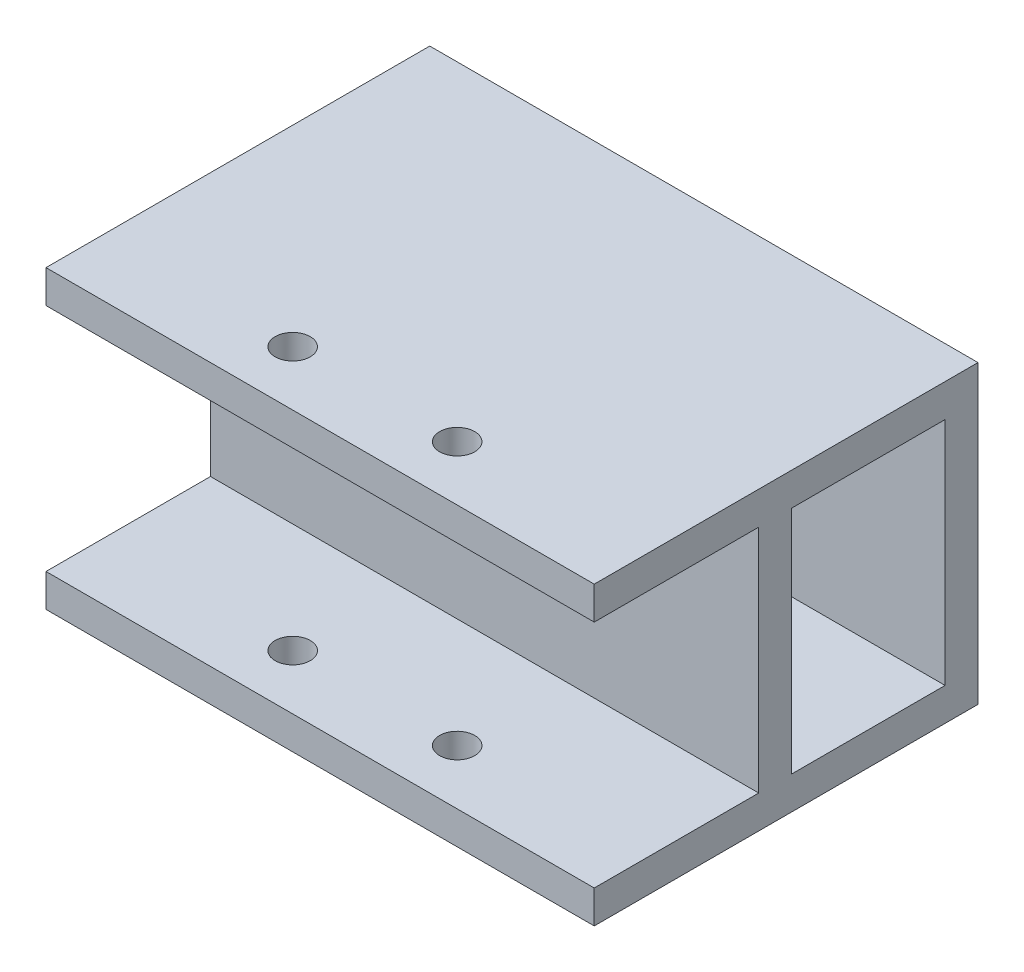
ISO-10303-21;
HEADER;
FILE_DESCRIPTION(('STEP AP214'),'2;1');
FILE_NAME('part.step','',(''),(''),'','','');
FILE_SCHEMA(('AUTOMOTIVE_DESIGN { 1 0 10303 214 1 1 1 1 }'));
ENDSEC;
DATA;
#1=APPLICATION_CONTEXT('core data for automotive mechanical design processes');
#2=APPLICATION_PROTOCOL_DEFINITION('international standard','automotive_design',2000,#1);
#3=PRODUCT_CONTEXT('',#1,'mechanical');
#4=PRODUCT('Part','Part','',(#3));
#5=PRODUCT_RELATED_PRODUCT_CATEGORY('part','',(#4));
#6=PRODUCT_DEFINITION_FORMATION('','',#4);
#7=PRODUCT_DEFINITION_CONTEXT('part definition',#1,'design');
#8=PRODUCT_DEFINITION('design','',#6,#7);
#9=PRODUCT_DEFINITION_SHAPE('','',#8);
#10=(LENGTH_UNIT() NAMED_UNIT(*) SI_UNIT(.MILLI.,.METRE.));
#11=(NAMED_UNIT(*) PLANE_ANGLE_UNIT() SI_UNIT($,.RADIAN.));
#12=(NAMED_UNIT(*) SI_UNIT($,.STERADIAN.) SOLID_ANGLE_UNIT());
#13=UNCERTAINTY_MEASURE_WITH_UNIT(LENGTH_MEASURE(1.E-05),#10,'distance_accuracy_value','');
#14=(GEOMETRIC_REPRESENTATION_CONTEXT(3) GLOBAL_UNCERTAINTY_ASSIGNED_CONTEXT((#13)) GLOBAL_UNIT_ASSIGNED_CONTEXT((#10,
#11,#12)) REPRESENTATION_CONTEXT('',''));
#15=CARTESIAN_POINT('',(0.,0.,0.));
#16=DIRECTION('',(0.,0.,1.));
#17=DIRECTION('',(1.,0.,0.));
#18=AXIS2_PLACEMENT_3D('',#15,#16,#17);
#19=CARTESIAN_POINT('',(0.,0.,35.));
#20=DIRECTION('',(0.,0.,1.));
#21=DIRECTION('',(1.,0.,0.));
#22=AXIS2_PLACEMENT_3D('',#19,#20,#21);
#23=PLANE('',#22);
#24=DIRECTION('',(-1.,0.,0.));
#25=VECTOR('',#24,1.);
#26=CARTESIAN_POINT('',(-21.1991434689508,10.3297644539615,35.));
#27=LINE('',#26,#25);
#28=CARTESIAN_POINT('',(28.8008565310493,10.3297644539615,35.));
#29=VERTEX_POINT('',#28);
#30=CARTESIAN_POINT('',(-21.1991434689508,10.3297644539615,35.));
#31=VERTEX_POINT('',#30);
#32=EDGE_CURVE('E216',#29,#31,#27,.T.);
#33=ORIENTED_EDGE('',*,*,#32,.F.);
#34=DIRECTION('',(0.,1.,0.));
#35=VECTOR('',#34,1.);
#36=CARTESIAN_POINT('',(28.8008565310493,13.3297644539615,35.));
#37=LINE('',#36,#35);
#38=CARTESIAN_POINT('',(28.8008565310493,13.3297644539615,35.));
#39=VERTEX_POINT('',#38);
#40=EDGE_CURVE('E254',#29,#39,#37,.T.);
#41=ORIENTED_EDGE('',*,*,#40,.T.);
#42=DIRECTION('',(-1.,0.,0.));
#43=VECTOR('',#42,1.);
#44=CARTESIAN_POINT('',(-21.1991434689508,13.3297644539615,35.));
#45=LINE('',#44,#43);
#46=CARTESIAN_POINT('',(-21.1991434689508,13.3297644539615,35.));
#47=VERTEX_POINT('',#46);
#48=EDGE_CURVE('E259',#39,#47,#45,.T.);
#49=ORIENTED_EDGE('',*,*,#48,.T.);
#50=DIRECTION('',(0.,-1.,0.));
#51=VECTOR('',#50,1.);
#52=CARTESIAN_POINT('',(-21.1991434689508,13.3297644539615,35.));
#53=LINE('',#52,#51);
#54=EDGE_CURVE('E246',#47,#31,#53,.T.);
#55=ORIENTED_EDGE('',*,*,#54,.T.);
#56=EDGE_LOOP('',(#33,#41,#49,#55));
#57=FACE_BOUND('',#56,.T.);
#58=ADVANCED_FACE('F45',(#57),#23,.T.);
#59=CARTESIAN_POINT('',(-21.1991434689508,13.3297644539615,35.));
#60=DIRECTION('',(1.,0.,0.));
#61=DIRECTION('',(0.,1.,0.));
#62=AXIS2_PLACEMENT_3D('',#59,#60,#61);
#63=PLANE('',#62);
#64=DIRECTION('',(0.,0.,1.));
#65=VECTOR('',#64,1.);
#66=CARTESIAN_POINT('',(-21.1991434689507,-10.6702355460385,3.));
#67=LINE('',#66,#65);
#68=CARTESIAN_POINT('',(-21.1991434689507,-10.6702355460385,3.));
#69=VERTEX_POINT('',#68);
#70=CARTESIAN_POINT('',(-21.1991434689507,-10.6702355460385,17.));
#71=VERTEX_POINT('',#70);
#72=EDGE_CURVE('E171',#69,#71,#67,.T.);
#73=ORIENTED_EDGE('',*,*,#72,.F.);
#74=DIRECTION('',(0.,-1.,0.));
#75=VECTOR('',#74,1.);
#76=CARTESIAN_POINT('',(-21.1991434689508,10.3297644539615,3.));
#77=LINE('',#76,#75);
#78=CARTESIAN_POINT('',(-21.1991434689508,10.3297644539615,3.));
#79=VERTEX_POINT('',#78);
#80=EDGE_CURVE('E63',#79,#69,#77,.T.);
#81=ORIENTED_EDGE('',*,*,#80,.F.);
#82=DIRECTION('',(0.,0.,-1.));
#83=VECTOR('',#82,1.);
#84=CARTESIAN_POINT('',(-21.1991434689508,10.3297644539615,3.));
#85=LINE('',#84,#83);
#86=CARTESIAN_POINT('',(-21.1991434689508,10.3297644539615,17.));
#87=VERTEX_POINT('',#86);
#88=EDGE_CURVE('E158',#87,#79,#85,.T.);
#89=ORIENTED_EDGE('',*,*,#88,.F.);
#90=DIRECTION('',(0.,1.,0.));
#91=VECTOR('',#90,1.);
#92=CARTESIAN_POINT('',(-21.1991434689508,10.3297644539615,17.));
#93=LINE('',#92,#91);
#94=EDGE_CURVE('E162',#71,#87,#93,.T.);
#95=ORIENTED_EDGE('',*,*,#94,.F.);
#96=EDGE_LOOP('',(#73,#81,#89,#95));
#97=FACE_BOUND('',#96,.T.);
#98=DIRECTION('',(0.,-1.,0.));
#99=VECTOR('',#98,1.);
#100=CARTESIAN_POINT('',(-21.1991434689508,10.3297644539615,20.));
#101=LINE('',#100,#99);
#102=CARTESIAN_POINT('',(-21.1991434689508,10.3297644539615,20.));
#103=VERTEX_POINT('',#102);
#104=CARTESIAN_POINT('',(-21.1991434689508,-10.6702355460385,20.));
#105=VERTEX_POINT('',#104);
#106=EDGE_CURVE('E211',#103,#105,#101,.T.);
#107=ORIENTED_EDGE('',*,*,#106,.F.);
#108=DIRECTION('',(0.,0.,1.));
#109=VECTOR('',#108,1.);
#110=CARTESIAN_POINT('',(-21.1991434689508,10.3297644539615,20.));
#111=LINE('',#110,#109);
#112=EDGE_CURVE('E232',#103,#31,#111,.T.);
#113=ORIENTED_EDGE('',*,*,#112,.T.);
#114=ORIENTED_EDGE('',*,*,#54,.F.);
#115=DIRECTION('',(0.,0.,-1.));
#116=VECTOR('',#115,1.);
#117=CARTESIAN_POINT('',(-21.1991434689508,13.3297644539615,35.));
#118=LINE('',#117,#116);
#119=CARTESIAN_POINT('',(-21.1991434689508,13.3297644539615,0.));
#120=VERTEX_POINT('',#119);
#121=EDGE_CURVE('E262',#47,#120,#118,.T.);
#122=ORIENTED_EDGE('',*,*,#121,.T.);
#123=DIRECTION('',(0.,-1.,0.));
#124=VECTOR('',#123,1.);
#125=CARTESIAN_POINT('',(-21.1991434689508,13.3297644539615,0.));
#126=LINE('',#125,#124);
#127=CARTESIAN_POINT('',(-21.1991434689507,-13.6702355460385,0.));
#128=VERTEX_POINT('',#127);
#129=EDGE_CURVE('E236',#120,#128,#126,.T.);
#130=ORIENTED_EDGE('',*,*,#129,.T.);
#131=DIRECTION('',(0.,0.,-1.));
#132=VECTOR('',#131,1.);
#133=CARTESIAN_POINT('',(-21.1991434689507,-13.6702355460385,35.));
#134=LINE('',#133,#132);
#135=CARTESIAN_POINT('',(-21.1991434689507,-13.6702355460385,35.));
#136=VERTEX_POINT('',#135);
#137=EDGE_CURVE('E11',#136,#128,#134,.T.);
#138=ORIENTED_EDGE('',*,*,#137,.F.);
#139=CARTESIAN_POINT('',(-21.1991434689507,-10.6702355460385,35.));
#140=VERTEX_POINT('',#139);
#141=EDGE_CURVE('E251',#140,#136,#53,.T.);
#142=ORIENTED_EDGE('',*,*,#141,.F.);
#143=DIRECTION('',(0.,0.,1.));
#144=VECTOR('',#143,1.);
#145=CARTESIAN_POINT('',(-21.1991434689508,-10.6702355460385,20.));
#146=LINE('',#145,#144);
#147=EDGE_CURVE('E227',#105,#140,#146,.T.);
#148=ORIENTED_EDGE('',*,*,#147,.F.);
#149=EDGE_LOOP('',(#107,#113,#114,#122,#130,#138,#142,#148));
#150=FACE_BOUND('',#149,.T.);
#151=ADVANCED_FACE('F47',(#97,#150),#63,.F.);
#152=CARTESIAN_POINT('',(-21.1991434689507,-13.6702355460385,35.));
#153=DIRECTION('',(0.,1.,0.));
#154=DIRECTION('',(0.,0.,1.));
#155=AXIS2_PLACEMENT_3D('',#152,#153,#154);
#156=PLANE('',#155);
#157=CARTESIAN_POINT('',(11.3008565310493,-13.6702355460385,30.));
#158=DIRECTION('',(0.,-1.,0.));
#159=DIRECTION('',(0.,0.,-1.));
#160=AXIS2_PLACEMENT_3D('',#157,#158,#159);
#161=CIRCLE('',#160,1.6);
#162=CARTESIAN_POINT('',(11.3008565310493,-13.6702355460385,28.4));
#163=VERTEX_POINT('',#162);
#164=EDGE_CURVE('E191',#163,#163,#161,.T.);
#165=ORIENTED_EDGE('',*,*,#164,.F.);
#166=EDGE_LOOP('',(#165));
#167=FACE_BOUND('',#166,.T.);
#168=CARTESIAN_POINT('',(-3.69914346895074,-13.6702355460385,30.));
#169=DIRECTION('',(0.,-1.,0.));
#170=DIRECTION('',(0.,0.,-1.));
#171=AXIS2_PLACEMENT_3D('',#168,#169,#170);
#172=CIRCLE('',#171,1.6);
#173=CARTESIAN_POINT('',(-3.69914346895074,-13.6702355460385,28.4));
#174=VERTEX_POINT('',#173);
#175=EDGE_CURVE('E195',#174,#174,#172,.T.);
#176=ORIENTED_EDGE('',*,*,#175,.F.);
#177=EDGE_LOOP('',(#176));
#178=FACE_BOUND('',#177,.T.);
#179=DIRECTION('',(1.,0.,0.));
#180=VECTOR('',#179,1.);
#181=CARTESIAN_POINT('',(-21.1991434689507,-13.6702355460385,0.));
#182=LINE('',#181,#180);
#183=CARTESIAN_POINT('',(28.8008565310493,-13.6702355460385,0.));
#184=VERTEX_POINT('',#183);
#185=EDGE_CURVE('E266',#128,#184,#182,.T.);
#186=ORIENTED_EDGE('',*,*,#185,.T.);
#187=DIRECTION('',(0.,0.,-1.));
#188=VECTOR('',#187,1.);
#189=CARTESIAN_POINT('',(28.8008565310493,-13.6702355460385,35.));
#190=LINE('',#189,#188);
#191=CARTESIAN_POINT('',(28.8008565310493,-13.6702355460385,35.));
#192=VERTEX_POINT('',#191);
#193=EDGE_CURVE('E55',#192,#184,#190,.T.);
#194=ORIENTED_EDGE('',*,*,#193,.F.);
#195=DIRECTION('',(1.,0.,0.));
#196=VECTOR('',#195,1.);
#197=CARTESIAN_POINT('',(-21.1991434689507,-13.6702355460385,35.));
#198=LINE('',#197,#196);
#199=EDGE_CURVE('E250',#136,#192,#198,.T.);
#200=ORIENTED_EDGE('',*,*,#199,.F.);
#201=ORIENTED_EDGE('',*,*,#137,.T.);
#202=EDGE_LOOP('',(#186,#194,#200,#201));
#203=FACE_BOUND('',#202,.T.);
#204=ADVANCED_FACE('F319',(#167,#178,#203),#156,.F.);
#205=CARTESIAN_POINT('',(28.8008565310493,13.3297644539615,35.));
#206=DIRECTION('',(-1.,0.,0.));
#207=DIRECTION('',(0.,-1.,0.));
#208=AXIS2_PLACEMENT_3D('',#205,#206,#207);
#209=PLANE('',#208);
#210=DIRECTION('',(0.,0.,-1.));
#211=VECTOR('',#210,1.);
#212=CARTESIAN_POINT('',(28.8008565310493,10.3297644539615,3.));
#213=LINE('',#212,#211);
#214=CARTESIAN_POINT('',(28.8008565310493,10.3297644539615,17.));
#215=VERTEX_POINT('',#214);
#216=CARTESIAN_POINT('',(28.8008565310493,10.3297644539615,3.));
#217=VERTEX_POINT('',#216);
#218=EDGE_CURVE('E146',#215,#217,#213,.T.);
#219=ORIENTED_EDGE('',*,*,#218,.T.);
#220=DIRECTION('',(0.,-1.,0.));
#221=VECTOR('',#220,1.);
#222=CARTESIAN_POINT('',(28.8008565310493,10.3297644539615,3.));
#223=LINE('',#222,#221);
#224=CARTESIAN_POINT('',(28.8008565310493,-10.6702355460385,3.));
#225=VERTEX_POINT('',#224);
#226=EDGE_CURVE('E139',#217,#225,#223,.T.);
#227=ORIENTED_EDGE('',*,*,#226,.T.);
#228=DIRECTION('',(0.,0.,1.));
#229=VECTOR('',#228,1.);
#230=CARTESIAN_POINT('',(28.8008565310493,-10.6702355460385,3.));
#231=LINE('',#230,#229);
#232=CARTESIAN_POINT('',(28.8008565310493,-10.6702355460385,17.));
#233=VERTEX_POINT('',#232);
#234=EDGE_CURVE('E149',#225,#233,#231,.T.);
#235=ORIENTED_EDGE('',*,*,#234,.T.);
#236=DIRECTION('',(0.,1.,0.));
#237=VECTOR('',#236,1.);
#238=CARTESIAN_POINT('',(28.8008565310493,10.3297644539615,17.));
#239=LINE('',#238,#237);
#240=EDGE_CURVE('E71',#233,#215,#239,.T.);
#241=ORIENTED_EDGE('',*,*,#240,.T.);
#242=EDGE_LOOP('',(#219,#227,#235,#241));
#243=FACE_BOUND('',#242,.T.);
#244=ORIENTED_EDGE('',*,*,#40,.F.);
#245=DIRECTION('',(0.,0.,1.));
#246=VECTOR('',#245,1.);
#247=CARTESIAN_POINT('',(28.8008565310493,10.3297644539615,20.));
#248=LINE('',#247,#246);
#249=CARTESIAN_POINT('',(28.8008565310493,10.3297644539615,20.));
#250=VERTEX_POINT('',#249);
#251=EDGE_CURVE('E237',#250,#29,#248,.T.);
#252=ORIENTED_EDGE('',*,*,#251,.F.);
#253=DIRECTION('',(0.,1.,0.));
#254=VECTOR('',#253,1.);
#255=CARTESIAN_POINT('',(28.8008565310493,10.3297644539615,20.));
#256=LINE('',#255,#254);
#257=CARTESIAN_POINT('',(28.8008565310493,-10.6702355460385,20.));
#258=VERTEX_POINT('',#257);
#259=EDGE_CURVE('E220',#258,#250,#256,.T.);
#260=ORIENTED_EDGE('',*,*,#259,.F.);
#261=DIRECTION('',(0.,0.,1.));
#262=VECTOR('',#261,1.);
#263=CARTESIAN_POINT('',(28.8008565310493,-10.6702355460385,20.));
#264=LINE('',#263,#262);
#265=CARTESIAN_POINT('',(28.8008565310493,-10.6702355460385,35.));
#266=VERTEX_POINT('',#265);
#267=EDGE_CURVE('E240',#258,#266,#264,.T.);
#268=ORIENTED_EDGE('',*,*,#267,.T.);
#269=EDGE_CURVE('E255',#192,#266,#37,.T.);
#270=ORIENTED_EDGE('',*,*,#269,.F.);
#271=ORIENTED_EDGE('',*,*,#193,.T.);
#272=DIRECTION('',(0.,1.,0.));
#273=VECTOR('',#272,1.);
#274=CARTESIAN_POINT('',(28.8008565310493,13.3297644539615,0.));
#275=LINE('',#274,#273);
#276=CARTESIAN_POINT('',(28.8008565310493,13.3297644539615,0.));
#277=VERTEX_POINT('',#276);
#278=EDGE_CURVE('E269',#184,#277,#275,.T.);
#279=ORIENTED_EDGE('',*,*,#278,.T.);
#280=DIRECTION('',(0.,0.,-1.));
#281=VECTOR('',#280,1.);
#282=CARTESIAN_POINT('',(28.8008565310493,13.3297644539615,35.));
#283=LINE('',#282,#281);
#284=EDGE_CURVE('E278',#39,#277,#283,.T.);
#285=ORIENTED_EDGE('',*,*,#284,.F.);
#286=EDGE_LOOP('',(#244,#252,#260,#268,#270,#271,#279,#285));
#287=FACE_BOUND('',#286,.T.);
#288=ADVANCED_FACE('F154',(#243,#287),#209,.F.);
#289=CARTESIAN_POINT('',(-21.1991434689508,13.3297644539615,35.));
#290=DIRECTION('',(0.,-1.,0.));
#291=DIRECTION('',(0.,0.,-1.));
#292=AXIS2_PLACEMENT_3D('',#289,#290,#291);
#293=PLANE('',#292);
#294=CARTESIAN_POINT('',(11.3008565310493,13.3297644539615,30.));
#295=DIRECTION('',(0.,-1.,0.));
#296=DIRECTION('',(0.,0.,-1.));
#297=AXIS2_PLACEMENT_3D('',#294,#295,#296);
#298=CIRCLE('',#297,1.6);
#299=CARTESIAN_POINT('',(11.3008565310493,13.3297644539615,28.4));
#300=VERTEX_POINT('',#299);
#301=EDGE_CURVE('E186',#300,#300,#298,.T.);
#302=ORIENTED_EDGE('',*,*,#301,.T.);
#303=EDGE_LOOP('',(#302));
#304=FACE_BOUND('',#303,.T.);
#305=CARTESIAN_POINT('',(-3.69914346895074,13.3297644539615,30.));
#306=DIRECTION('',(0.,-1.,0.));
#307=DIRECTION('',(0.,0.,-1.));
#308=AXIS2_PLACEMENT_3D('',#305,#306,#307);
#309=CIRCLE('',#308,1.6);
#310=CARTESIAN_POINT('',(-3.69914346895074,13.3297644539615,28.4));
#311=VERTEX_POINT('',#310);
#312=EDGE_CURVE('E180',#311,#311,#309,.T.);
#313=ORIENTED_EDGE('',*,*,#312,.T.);
#314=EDGE_LOOP('',(#313));
#315=FACE_BOUND('',#314,.T.);
#316=DIRECTION('',(-1.,0.,0.));
#317=VECTOR('',#316,1.);
#318=CARTESIAN_POINT('',(-21.1991434689508,13.3297644539615,0.));
#319=LINE('',#318,#317);
#320=EDGE_CURVE('E272',#277,#120,#319,.T.);
#321=ORIENTED_EDGE('',*,*,#320,.T.);
#322=ORIENTED_EDGE('',*,*,#121,.F.);
#323=ORIENTED_EDGE('',*,*,#48,.F.);
#324=ORIENTED_EDGE('',*,*,#284,.T.);
#325=EDGE_LOOP('',(#321,#322,#323,#324));
#326=FACE_BOUND('',#325,.T.);
#327=ADVANCED_FACE('F325',(#304,#315,#326),#293,.F.);
#328=DIRECTION('',(1.,0.,0.));
#329=VECTOR('',#328,1.);
#330=CARTESIAN_POINT('',(-21.1991434689508,-10.6702355460385,35.));
#331=LINE('',#330,#329);
#332=EDGE_CURVE('E210',#140,#266,#331,.T.);
#333=ORIENTED_EDGE('',*,*,#332,.F.);
#334=ORIENTED_EDGE('',*,*,#141,.T.);
#335=ORIENTED_EDGE('',*,*,#199,.T.);
#336=ORIENTED_EDGE('',*,*,#269,.T.);
#337=EDGE_LOOP('',(#333,#334,#335,#336));
#338=FACE_BOUND('',#337,.T.);
#339=ADVANCED_FACE('F313',(#338),#23,.T.);
#340=CARTESIAN_POINT('',(0.,0.,0.));
#341=DIRECTION('',(0.,0.,1.));
#342=DIRECTION('',(1.,0.,0.));
#343=AXIS2_PLACEMENT_3D('',#340,#341,#342);
#344=PLANE('',#343);
#345=ORIENTED_EDGE('',*,*,#129,.F.);
#346=ORIENTED_EDGE('',*,*,#320,.F.);
#347=ORIENTED_EDGE('',*,*,#278,.F.);
#348=ORIENTED_EDGE('',*,*,#185,.F.);
#349=EDGE_LOOP('',(#345,#346,#347,#348));
#350=FACE_BOUND('',#349,.T.);
#351=ADVANCED_FACE('F324',(#350),#344,.F.);
#352=CARTESIAN_POINT('',(-21.1991434689508,10.3297644539615,20.));
#353=DIRECTION('',(0.,1.,0.));
#354=DIRECTION('',(0.,0.,1.));
#355=AXIS2_PLACEMENT_3D('',#352,#353,#354);
#356=PLANE('',#355);
#357=CARTESIAN_POINT('',(11.3008565310493,10.3297644539615,30.));
#358=DIRECTION('',(0.,1.,0.));
#359=DIRECTION('',(0.,0.,1.));
#360=AXIS2_PLACEMENT_3D('',#357,#358,#359);
#361=CIRCLE('',#360,1.6);
#362=CARTESIAN_POINT('',(11.3008565310493,10.3297644539615,31.6));
#363=VERTEX_POINT('',#362);
#364=EDGE_CURVE('E206',#363,#363,#361,.T.);
#365=ORIENTED_EDGE('',*,*,#364,.T.);
#366=EDGE_LOOP('',(#365));
#367=FACE_BOUND('',#366,.T.);
#368=CARTESIAN_POINT('',(-3.69914346895074,10.3297644539615,30.));
#369=DIRECTION('',(0.,1.,0.));
#370=DIRECTION('',(0.,0.,1.));
#371=AXIS2_PLACEMENT_3D('',#368,#369,#370);
#372=CIRCLE('',#371,1.6);
#373=CARTESIAN_POINT('',(-3.69914346895074,10.3297644539615,31.6));
#374=VERTEX_POINT('',#373);
#375=EDGE_CURVE('E202',#374,#374,#372,.T.);
#376=ORIENTED_EDGE('',*,*,#375,.T.);
#377=EDGE_LOOP('',(#376));
#378=FACE_BOUND('',#377,.T.);
#379=ORIENTED_EDGE('',*,*,#32,.T.);
#380=ORIENTED_EDGE('',*,*,#112,.F.);
#381=DIRECTION('',(-1.,0.,0.));
#382=VECTOR('',#381,1.);
#383=CARTESIAN_POINT('',(-21.1991434689508,10.3297644539615,20.));
#384=LINE('',#383,#382);
#385=EDGE_CURVE('E223',#250,#103,#384,.T.);
#386=ORIENTED_EDGE('',*,*,#385,.F.);
#387=ORIENTED_EDGE('',*,*,#251,.T.);
#388=EDGE_LOOP('',(#379,#380,#386,#387));
#389=FACE_BOUND('',#388,.T.);
#390=ADVANCED_FACE('F329',(#367,#378,#389),#356,.F.);
#391=CARTESIAN_POINT('',(-21.1991434689508,-10.6702355460385,20.));
#392=DIRECTION('',(0.,-1.,0.));
#393=DIRECTION('',(0.,0.,-1.));
#394=AXIS2_PLACEMENT_3D('',#391,#392,#393);
#395=PLANE('',#394);
#396=CARTESIAN_POINT('',(11.3008565310493,-10.6702355460385,30.));
#397=DIRECTION('',(0.,-1.,0.));
#398=DIRECTION('',(0.,0.,-1.));
#399=AXIS2_PLACEMENT_3D('',#396,#397,#398);
#400=CIRCLE('',#399,1.6);
#401=CARTESIAN_POINT('',(11.3008565310493,-10.6702355460385,28.4));
#402=VERTEX_POINT('',#401);
#403=EDGE_CURVE('E49',#402,#402,#400,.T.);
#404=ORIENTED_EDGE('',*,*,#403,.T.);
#405=EDGE_LOOP('',(#404));
#406=FACE_BOUND('',#405,.T.);
#407=CARTESIAN_POINT('',(-3.69914346895074,-10.6702355460385,30.));
#408=DIRECTION('',(0.,-1.,0.));
#409=DIRECTION('',(0.,0.,-1.));
#410=AXIS2_PLACEMENT_3D('',#407,#408,#409);
#411=CIRCLE('',#410,1.6);
#412=CARTESIAN_POINT('',(-3.69914346895074,-10.6702355460385,28.4));
#413=VERTEX_POINT('',#412);
#414=EDGE_CURVE('E190',#413,#413,#411,.T.);
#415=ORIENTED_EDGE('',*,*,#414,.T.);
#416=EDGE_LOOP('',(#415));
#417=FACE_BOUND('',#416,.T.);
#418=ORIENTED_EDGE('',*,*,#332,.T.);
#419=ORIENTED_EDGE('',*,*,#267,.F.);
#420=DIRECTION('',(1.,0.,0.));
#421=VECTOR('',#420,1.);
#422=CARTESIAN_POINT('',(-21.1991434689508,-10.6702355460385,20.));
#423=LINE('',#422,#421);
#424=EDGE_CURVE('E215',#105,#258,#423,.T.);
#425=ORIENTED_EDGE('',*,*,#424,.F.);
#426=ORIENTED_EDGE('',*,*,#147,.T.);
#427=EDGE_LOOP('',(#418,#419,#425,#426));
#428=FACE_BOUND('',#427,.T.);
#429=ADVANCED_FACE('F288',(#406,#417,#428),#395,.F.);
#430=CARTESIAN_POINT('',(0.,0.,20.));
#431=DIRECTION('',(0.,0.,1.));
#432=DIRECTION('',(1.,0.,0.));
#433=AXIS2_PLACEMENT_3D('',#430,#431,#432);
#434=PLANE('',#433);
#435=ORIENTED_EDGE('',*,*,#106,.T.);
#436=ORIENTED_EDGE('',*,*,#424,.T.);
#437=ORIENTED_EDGE('',*,*,#259,.T.);
#438=ORIENTED_EDGE('',*,*,#385,.T.);
#439=EDGE_LOOP('',(#435,#436,#437,#438));
#440=FACE_BOUND('',#439,.T.);
#441=ADVANCED_FACE('F294',(#440),#434,.T.);
#442=CARTESIAN_POINT('',(-3.69914346895074,13.3297644539615,30.));
#443=DIRECTION('',(0.,-1.,0.));
#444=DIRECTION('',(0.,0.,-1.));
#445=AXIS2_PLACEMENT_3D('',#442,#443,#444);
#446=CYLINDRICAL_SURFACE('',#445,1.6);
#447=ORIENTED_EDGE('',*,*,#175,.T.);
#448=EDGE_LOOP('',(#447));
#449=FACE_BOUND('',#448,.T.);
#450=ORIENTED_EDGE('',*,*,#414,.F.);
#451=EDGE_LOOP('',(#450));
#452=FACE_BOUND('',#451,.T.);
#453=ADVANCED_FACE('F291',(#449,#452),#446,.F.);
#454=CARTESIAN_POINT('',(11.3008565310493,13.3297644539615,30.));
#455=DIRECTION('',(0.,-1.,0.));
#456=DIRECTION('',(0.,0.,-1.));
#457=AXIS2_PLACEMENT_3D('',#454,#455,#456);
#458=CYLINDRICAL_SURFACE('',#457,1.6);
#459=ORIENTED_EDGE('',*,*,#164,.T.);
#460=EDGE_LOOP('',(#459));
#461=FACE_BOUND('',#460,.T.);
#462=ORIENTED_EDGE('',*,*,#403,.F.);
#463=EDGE_LOOP('',(#462));
#464=FACE_BOUND('',#463,.T.);
#465=ADVANCED_FACE('F293',(#461,#464),#458,.F.);
#466=ORIENTED_EDGE('',*,*,#312,.F.);
#467=EDGE_LOOP('',(#466));
#468=FACE_BOUND('',#467,.T.);
#469=ORIENTED_EDGE('',*,*,#375,.F.);
#470=EDGE_LOOP('',(#469));
#471=FACE_BOUND('',#470,.T.);
#472=ADVANCED_FACE('F297',(#468,#471),#446,.F.);
#473=ORIENTED_EDGE('',*,*,#301,.F.);
#474=EDGE_LOOP('',(#473));
#475=FACE_BOUND('',#474,.T.);
#476=ORIENTED_EDGE('',*,*,#364,.F.);
#477=EDGE_LOOP('',(#476));
#478=FACE_BOUND('',#477,.T.);
#479=ADVANCED_FACE('F304',(#475,#478),#458,.F.);
#480=CARTESIAN_POINT('',(28.8008565310493,10.3297644539615,3.));
#481=DIRECTION('',(0.,0.,-1.));
#482=DIRECTION('',(0.,1.,0.));
#483=AXIS2_PLACEMENT_3D('',#480,#481,#482);
#484=PLANE('',#483);
#485=ORIENTED_EDGE('',*,*,#80,.T.);
#486=DIRECTION('',(-1.,0.,0.));
#487=VECTOR('',#486,1.);
#488=CARTESIAN_POINT('',(28.8008565310493,-10.6702355460385,3.));
#489=LINE('',#488,#487);
#490=EDGE_CURVE('E135',#225,#69,#489,.T.);
#491=ORIENTED_EDGE('',*,*,#490,.F.);
#492=ORIENTED_EDGE('',*,*,#226,.F.);
#493=DIRECTION('',(-1.,0.,0.));
#494=VECTOR('',#493,1.);
#495=CARTESIAN_POINT('',(28.8008565310493,10.3297644539615,3.));
#496=LINE('',#495,#494);
#497=EDGE_CURVE('E177',#217,#79,#496,.T.);
#498=ORIENTED_EDGE('',*,*,#497,.T.);
#499=EDGE_LOOP('',(#485,#491,#492,#498));
#500=FACE_BOUND('',#499,.T.);
#501=ADVANCED_FACE('F137',(#500),#484,.F.);
#502=CARTESIAN_POINT('',(28.8008565310493,10.3297644539615,3.));
#503=DIRECTION('',(0.,1.,0.));
#504=DIRECTION('',(-1.,0.,0.));
#505=AXIS2_PLACEMENT_3D('',#502,#503,#504);
#506=PLANE('',#505);
#507=ORIENTED_EDGE('',*,*,#88,.T.);
#508=ORIENTED_EDGE('',*,*,#497,.F.);
#509=ORIENTED_EDGE('',*,*,#218,.F.);
#510=DIRECTION('',(-1.,0.,0.));
#511=VECTOR('',#510,1.);
#512=CARTESIAN_POINT('',(28.8008565310493,10.3297644539615,17.));
#513=LINE('',#512,#511);
#514=EDGE_CURVE('E181',#215,#87,#513,.T.);
#515=ORIENTED_EDGE('',*,*,#514,.T.);
#516=EDGE_LOOP('',(#507,#508,#509,#515));
#517=FACE_BOUND('',#516,.T.);
#518=ADVANCED_FACE('F456',(#517),#506,.F.);
#519=CARTESIAN_POINT('',(28.8008565310493,10.3297644539615,17.));
#520=DIRECTION('',(0.,0.,1.));
#521=DIRECTION('',(0.,-1.,0.));
#522=AXIS2_PLACEMENT_3D('',#519,#520,#521);
#523=PLANE('',#522);
#524=ORIENTED_EDGE('',*,*,#94,.T.);
#525=ORIENTED_EDGE('',*,*,#514,.F.);
#526=ORIENTED_EDGE('',*,*,#240,.F.);
#527=DIRECTION('',(-1.,0.,0.));
#528=VECTOR('',#527,1.);
#529=CARTESIAN_POINT('',(28.8008565310493,-10.6702355460385,17.));
#530=LINE('',#529,#528);
#531=EDGE_CURVE('E145',#233,#71,#530,.T.);
#532=ORIENTED_EDGE('',*,*,#531,.T.);
#533=EDGE_LOOP('',(#524,#525,#526,#532));
#534=FACE_BOUND('',#533,.T.);
#535=ADVANCED_FACE('F465',(#534),#523,.F.);
#536=CARTESIAN_POINT('',(28.8008565310493,-10.6702355460385,3.));
#537=DIRECTION('',(0.,-1.,0.));
#538=DIRECTION('',(1.,0.,0.));
#539=AXIS2_PLACEMENT_3D('',#536,#537,#538);
#540=PLANE('',#539);
#541=ORIENTED_EDGE('',*,*,#72,.T.);
#542=ORIENTED_EDGE('',*,*,#531,.F.);
#543=ORIENTED_EDGE('',*,*,#234,.F.);
#544=ORIENTED_EDGE('',*,*,#490,.T.);
#545=EDGE_LOOP('',(#541,#542,#543,#544));
#546=FACE_BOUND('',#545,.T.);
#547=ADVANCED_FACE('F150',(#546),#540,.F.);
#548=CLOSED_SHELL('',(#58,#151,#204,#288,#327,#339,#351,#390,#429,#441,#453,#465,#472,#479,#501,
#518,#535,#547));
#549=MANIFOLD_SOLID_BREP('B2',#548);
#550=ADVANCED_BREP_SHAPE_REPRESENTATION('',(#18,#549),#14);
#551=SHAPE_DEFINITION_REPRESENTATION(#9,#550);
ENDSEC;
END-ISO-10303-21;
